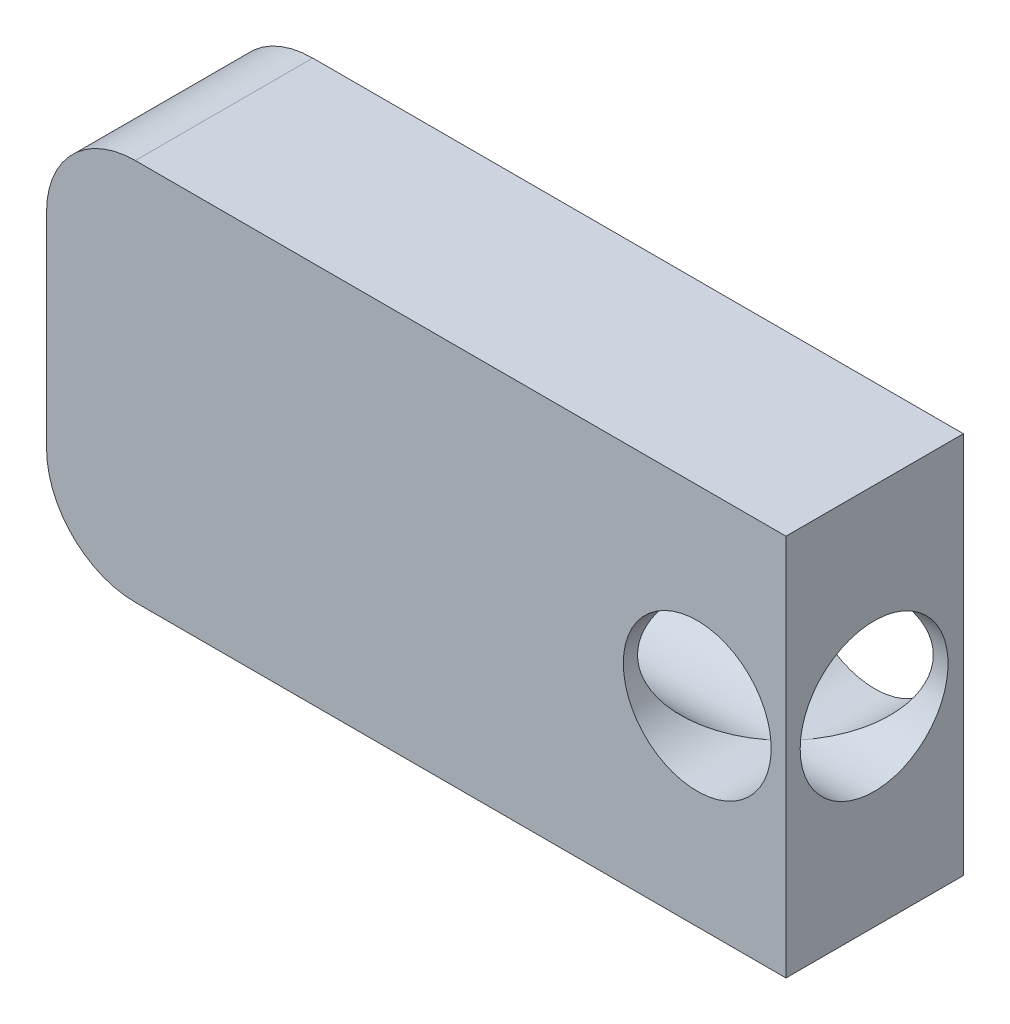
ISO-10303-21;
HEADER;
FILE_DESCRIPTION(('STEP AP214'),'2;1');
FILE_NAME('part.step','',(''),(''),'','','');
FILE_SCHEMA(('AUTOMOTIVE_DESIGN { 1 0 10303 214 1 1 1 1 }'));
ENDSEC;
DATA;
#1=APPLICATION_CONTEXT('core data for automotive mechanical design processes');
#2=APPLICATION_PROTOCOL_DEFINITION('international standard','automotive_design',2000,#1);
#3=PRODUCT_CONTEXT('',#1,'mechanical');
#4=PRODUCT('Part','Part','',(#3));
#5=PRODUCT_RELATED_PRODUCT_CATEGORY('part','',(#4));
#6=PRODUCT_DEFINITION_FORMATION('','',#4);
#7=PRODUCT_DEFINITION_CONTEXT('part definition',#1,'design');
#8=PRODUCT_DEFINITION('design','',#6,#7);
#9=PRODUCT_DEFINITION_SHAPE('','',#8);
#10=(LENGTH_UNIT() NAMED_UNIT(*) SI_UNIT(.MILLI.,.METRE.));
#11=(NAMED_UNIT(*) PLANE_ANGLE_UNIT() SI_UNIT($,.RADIAN.));
#12=(NAMED_UNIT(*) SI_UNIT($,.STERADIAN.) SOLID_ANGLE_UNIT());
#13=UNCERTAINTY_MEASURE_WITH_UNIT(LENGTH_MEASURE(1.E-05),#10,'distance_accuracy_value','');
#14=(GEOMETRIC_REPRESENTATION_CONTEXT(3) GLOBAL_UNCERTAINTY_ASSIGNED_CONTEXT((#13)) GLOBAL_UNIT_ASSIGNED_CONTEXT((#10,
#11,#12)) REPRESENTATION_CONTEXT('',''));
#15=CARTESIAN_POINT('',(0.,0.,0.));
#16=DIRECTION('',(0.,0.,1.));
#17=DIRECTION('',(1.,0.,0.));
#18=AXIS2_PLACEMENT_3D('',#15,#16,#17);
#19=CARTESIAN_POINT('',(9.5,0.,6.));
#20=DIRECTION('',(0.,0.,-1.));
#21=DIRECTION('',(-1.,0.,0.));
#22=AXIS2_PLACEMENT_3D('',#19,#20,#21);
#23=CYLINDRICAL_SURFACE('',#22,2.5);
#24=CARTESIAN_POINT('',(9.5,0.,3.01965173208943));
#25=DIRECTION('',(-0.707106781186547,0.,-0.707106781186547));
#26=DIRECTION('',(0.707106781186547,0.,-0.707106781186547));
#27=AXIS2_PLACEMENT_3D('',#24,#25,#26);
#28=ELLIPSE('',#27,3.53553390593274,2.5);
#29=CARTESIAN_POINT('',(9.5,2.5,3.01965173208943));
#30=VERTEX_POINT('',#29);
#31=CARTESIAN_POINT('',(9.5,-2.5,3.01965173208943));
#32=VERTEX_POINT('',#31);
#33=EDGE_CURVE('E11',#30,#32,#28,.F.);
#34=ORIENTED_EDGE('',*,*,#33,.F.);
#35=CARTESIAN_POINT('',(9.5,0.,3.01965173208943));
#36=DIRECTION('',(0.707106781186547,0.,-0.707106781186547));
#37=DIRECTION('',(-0.707106781186547,0.,-0.707106781186547));
#38=AXIS2_PLACEMENT_3D('',#35,#36,#37);
#39=ELLIPSE('',#38,3.53553390593274,2.5);
#40=EDGE_CURVE('E53',#32,#30,#39,.F.);
#41=ORIENTED_EDGE('',*,*,#40,.F.);
#42=EDGE_LOOP('',(#34,#41));
#43=FACE_BOUND('',#42,.T.);
#44=CARTESIAN_POINT('',(9.5,0.,6.));
#45=DIRECTION('',(0.,0.,1.));
#46=DIRECTION('',(-1.,0.,0.));
#47=AXIS2_PLACEMENT_3D('',#44,#45,#46);
#48=CIRCLE('',#47,2.5);
#49=CARTESIAN_POINT('',(7.,0.,6.));
#50=VERTEX_POINT('',#49);
#51=EDGE_CURVE('E139',#50,#50,#48,.T.);
#52=ORIENTED_EDGE('',*,*,#51,.T.);
#53=EDGE_LOOP('',(#52));
#54=FACE_BOUND('',#53,.T.);
#55=ADVANCED_FACE('F39',(#43,#54),#23,.F.);
#56=CARTESIAN_POINT('',(-9.5,-3.46843733601267,6.));
#57=DIRECTION('',(0.,0.,1.));
#58=DIRECTION('',(1.,0.,0.));
#59=AXIS2_PLACEMENT_3D('',#56,#57,#58);
#60=PLANE('',#59);
#61=DIRECTION('',(0.,1.,0.));
#62=VECTOR('',#61,1.);
#63=CARTESIAN_POINT('',(12.5,6.46843733601267,6.));
#64=LINE('',#63,#62);
#65=CARTESIAN_POINT('',(12.5,-6.46843733601267,6.));
#66=VERTEX_POINT('',#65);
#67=CARTESIAN_POINT('',(12.5,6.46843733601267,6.));
#68=VERTEX_POINT('',#67);
#69=EDGE_CURVE('E147',#66,#68,#64,.T.);
#70=ORIENTED_EDGE('',*,*,#69,.T.);
#71=DIRECTION('',(-1.,0.,0.));
#72=VECTOR('',#71,1.);
#73=CARTESIAN_POINT('',(-9.49999999999998,6.46843733601267,6.));
#74=LINE('',#73,#72);
#75=CARTESIAN_POINT('',(-9.49999999999998,6.46843733601267,6.));
#76=VERTEX_POINT('',#75);
#77=EDGE_CURVE('E98',#68,#76,#74,.T.);
#78=ORIENTED_EDGE('',*,*,#77,.T.);
#79=CARTESIAN_POINT('',(-9.5,3.46843733601267,6.));
#80=DIRECTION('',(0.,0.,1.));
#81=DIRECTION('',(1.,0.,0.));
#82=AXIS2_PLACEMENT_3D('',#79,#80,#81);
#83=CIRCLE('',#82,3.);
#84=CARTESIAN_POINT('',(-12.5,3.46843733601265,6.));
#85=VERTEX_POINT('',#84);
#86=EDGE_CURVE('E114',#76,#85,#83,.T.);
#87=ORIENTED_EDGE('',*,*,#86,.T.);
#88=DIRECTION('',(0.,-1.,0.));
#89=VECTOR('',#88,1.);
#90=CARTESIAN_POINT('',(-12.5,3.46843733601265,6.));
#91=LINE('',#90,#89);
#92=CARTESIAN_POINT('',(-12.5,-3.46843733601265,6.));
#93=VERTEX_POINT('',#92);
#94=EDGE_CURVE('E106',#85,#93,#91,.T.);
#95=ORIENTED_EDGE('',*,*,#94,.T.);
#96=CARTESIAN_POINT('',(-9.5,-3.46843733601267,6.));
#97=DIRECTION('',(0.,0.,1.));
#98=DIRECTION('',(1.,0.,0.));
#99=AXIS2_PLACEMENT_3D('',#96,#97,#98);
#100=CIRCLE('',#99,3.);
#101=CARTESIAN_POINT('',(-9.49999999999998,-6.46843733601267,6.));
#102=VERTEX_POINT('',#101);
#103=EDGE_CURVE('E111',#93,#102,#100,.T.);
#104=ORIENTED_EDGE('',*,*,#103,.T.);
#105=DIRECTION('',(1.,0.,0.));
#106=VECTOR('',#105,1.);
#107=CARTESIAN_POINT('',(-9.49999999999998,-6.46843733601267,6.));
#108=LINE('',#107,#106);
#109=EDGE_CURVE('E62',#102,#66,#108,.T.);
#110=ORIENTED_EDGE('',*,*,#109,.T.);
#111=EDGE_LOOP('',(#70,#78,#87,#95,#104,#110));
#112=FACE_BOUND('',#111,.T.);
#113=ORIENTED_EDGE('',*,*,#51,.F.);
#114=EDGE_LOOP('',(#113));
#115=FACE_BOUND('',#114,.T.);
#116=ADVANCED_FACE('F108',(#112,#115),#60,.T.);
#117=CARTESIAN_POINT('',(-9.5,-3.46843733601267,0.));
#118=DIRECTION('',(0.,0.,1.));
#119=DIRECTION('',(1.,0.,0.));
#120=AXIS2_PLACEMENT_3D('',#117,#118,#119);
#121=PLANE('',#120);
#122=DIRECTION('',(0.,1.,0.));
#123=VECTOR('',#122,1.);
#124=CARTESIAN_POINT('',(12.5,6.46843733601267,0.));
#125=LINE('',#124,#123);
#126=CARTESIAN_POINT('',(12.5,-6.46843733601267,0.));
#127=VERTEX_POINT('',#126);
#128=CARTESIAN_POINT('',(12.5,6.46843733601267,0.));
#129=VERTEX_POINT('',#128);
#130=EDGE_CURVE('E135',#127,#129,#125,.T.);
#131=ORIENTED_EDGE('',*,*,#130,.F.);
#132=DIRECTION('',(1.,0.,0.));
#133=VECTOR('',#132,1.);
#134=CARTESIAN_POINT('',(-9.49999999999998,-6.46843733601267,0.));
#135=LINE('',#134,#133);
#136=CARTESIAN_POINT('',(-9.49999999999998,-6.46843733601267,0.));
#137=VERTEX_POINT('',#136);
#138=EDGE_CURVE('E89',#137,#127,#135,.T.);
#139=ORIENTED_EDGE('',*,*,#138,.F.);
#140=CARTESIAN_POINT('',(-9.5,-3.46843733601267,0.));
#141=DIRECTION('',(0.,0.,1.));
#142=DIRECTION('',(1.,0.,0.));
#143=AXIS2_PLACEMENT_3D('',#140,#141,#142);
#144=CIRCLE('',#143,3.);
#145=CARTESIAN_POINT('',(-12.5,-3.46843733601265,0.));
#146=VERTEX_POINT('',#145);
#147=EDGE_CURVE('E144',#146,#137,#144,.T.);
#148=ORIENTED_EDGE('',*,*,#147,.F.);
#149=DIRECTION('',(0.,-1.,0.));
#150=VECTOR('',#149,1.);
#151=CARTESIAN_POINT('',(-12.5,3.46843733601265,0.));
#152=LINE('',#151,#150);
#153=CARTESIAN_POINT('',(-12.5,3.46843733601265,0.));
#154=VERTEX_POINT('',#153);
#155=EDGE_CURVE('E123',#154,#146,#152,.T.);
#156=ORIENTED_EDGE('',*,*,#155,.F.);
#157=CARTESIAN_POINT('',(-9.5,3.46843733601267,0.));
#158=DIRECTION('',(0.,0.,1.));
#159=DIRECTION('',(1.,0.,0.));
#160=AXIS2_PLACEMENT_3D('',#157,#158,#159);
#161=CIRCLE('',#160,3.);
#162=CARTESIAN_POINT('',(-9.49999999999998,6.46843733601267,0.));
#163=VERTEX_POINT('',#162);
#164=EDGE_CURVE('E141',#163,#154,#161,.T.);
#165=ORIENTED_EDGE('',*,*,#164,.F.);
#166=DIRECTION('',(-1.,0.,0.));
#167=VECTOR('',#166,1.);
#168=CARTESIAN_POINT('',(-9.49999999999998,6.46843733601267,0.));
#169=LINE('',#168,#167);
#170=EDGE_CURVE('E138',#129,#163,#169,.T.);
#171=ORIENTED_EDGE('',*,*,#170,.F.);
#172=EDGE_LOOP('',(#131,#139,#148,#156,#165,#171));
#173=FACE_BOUND('',#172,.T.);
#174=CARTESIAN_POINT('',(9.5,0.,0.));
#175=DIRECTION('',(0.,0.,1.));
#176=DIRECTION('',(-1.,0.,0.));
#177=AXIS2_PLACEMENT_3D('',#174,#175,#176);
#178=CIRCLE('',#177,2.5);
#179=CARTESIAN_POINT('',(7.,0.,0.));
#180=VERTEX_POINT('',#179);
#181=EDGE_CURVE('E175',#180,#180,#178,.T.);
#182=ORIENTED_EDGE('',*,*,#181,.T.);
#183=EDGE_LOOP('',(#182));
#184=FACE_BOUND('',#183,.T.);
#185=ADVANCED_FACE('F195',(#173,#184),#121,.F.);
#186=CARTESIAN_POINT('',(12.5,6.46843733601267,6.));
#187=DIRECTION('',(-1.,0.,0.));
#188=DIRECTION('',(0.,0.,1.));
#189=AXIS2_PLACEMENT_3D('',#186,#187,#188);
#190=PLANE('',#189);
#191=CARTESIAN_POINT('',(12.5,0.,3.01965173208943));
#192=DIRECTION('',(-1.,0.,0.));
#193=DIRECTION('',(0.,0.,1.));
#194=AXIS2_PLACEMENT_3D('',#191,#192,#193);
#195=CIRCLE('',#194,2.5);
#196=CARTESIAN_POINT('',(12.5,0.,5.51965173208943));
#197=VERTEX_POINT('',#196);
#198=EDGE_CURVE('E177',#197,#197,#195,.T.);
#199=ORIENTED_EDGE('',*,*,#198,.T.);
#200=EDGE_LOOP('',(#199));
#201=FACE_BOUND('',#200,.T.);
#202=ORIENTED_EDGE('',*,*,#130,.T.);
#203=DIRECTION('',(0.,0.,-1.));
#204=VECTOR('',#203,1.);
#205=CARTESIAN_POINT('',(12.5,6.46843733601267,6.));
#206=LINE('',#205,#204);
#207=EDGE_CURVE('E154',#68,#129,#206,.T.);
#208=ORIENTED_EDGE('',*,*,#207,.F.);
#209=ORIENTED_EDGE('',*,*,#69,.F.);
#210=DIRECTION('',(0.,0.,-1.));
#211=VECTOR('',#210,1.);
#212=CARTESIAN_POINT('',(12.5,-6.46843733601267,6.));
#213=LINE('',#212,#211);
#214=EDGE_CURVE('E131',#66,#127,#213,.T.);
#215=ORIENTED_EDGE('',*,*,#214,.T.);
#216=EDGE_LOOP('',(#202,#208,#209,#215));
#217=FACE_BOUND('',#216,.T.);
#218=ADVANCED_FACE('F41',(#201,#217),#190,.F.);
#219=CARTESIAN_POINT('',(-9.49999999999998,6.46843733601267,6.));
#220=DIRECTION('',(0.,-1.,0.));
#221=DIRECTION('',(0.,0.,-1.));
#222=AXIS2_PLACEMENT_3D('',#219,#220,#221);
#223=PLANE('',#222);
#224=ORIENTED_EDGE('',*,*,#170,.T.);
#225=DIRECTION('',(0.,0.,-1.));
#226=VECTOR('',#225,1.);
#227=CARTESIAN_POINT('',(-9.49999999999998,6.46843733601267,6.));
#228=LINE('',#227,#226);
#229=EDGE_CURVE('E151',#76,#163,#228,.T.);
#230=ORIENTED_EDGE('',*,*,#229,.F.);
#231=ORIENTED_EDGE('',*,*,#77,.F.);
#232=ORIENTED_EDGE('',*,*,#207,.T.);
#233=EDGE_LOOP('',(#224,#230,#231,#232));
#234=FACE_BOUND('',#233,.T.);
#235=ADVANCED_FACE('F189',(#234),#223,.F.);
#236=CARTESIAN_POINT('',(-9.5,3.46843733601267,6.));
#237=DIRECTION('',(0.,0.,-1.));
#238=DIRECTION('',(-1.,0.,0.));
#239=AXIS2_PLACEMENT_3D('',#236,#237,#238);
#240=CYLINDRICAL_SURFACE('',#239,3.);
#241=ORIENTED_EDGE('',*,*,#164,.T.);
#242=DIRECTION('',(0.,0.,-1.));
#243=VECTOR('',#242,1.);
#244=CARTESIAN_POINT('',(-12.5,3.46843733601265,6.));
#245=LINE('',#244,#243);
#246=EDGE_CURVE('E126',#85,#154,#245,.T.);
#247=ORIENTED_EDGE('',*,*,#246,.F.);
#248=ORIENTED_EDGE('',*,*,#86,.F.);
#249=ORIENTED_EDGE('',*,*,#229,.T.);
#250=EDGE_LOOP('',(#241,#247,#248,#249));
#251=FACE_BOUND('',#250,.T.);
#252=ADVANCED_FACE('F192',(#251),#240,.T.);
#253=CARTESIAN_POINT('',(-12.5,3.46843733601265,6.));
#254=DIRECTION('',(1.,0.,0.));
#255=DIRECTION('',(0.,0.,-1.));
#256=AXIS2_PLACEMENT_3D('',#253,#254,#255);
#257=PLANE('',#256);
#258=CARTESIAN_POINT('',(-12.5,0.,3.01965173208943));
#259=DIRECTION('',(-1.,0.,0.));
#260=DIRECTION('',(0.,0.,1.));
#261=AXIS2_PLACEMENT_3D('',#258,#259,#260);
#262=CIRCLE('',#261,2.5);
#263=CARTESIAN_POINT('',(-12.5,0.,5.51965173208943));
#264=VERTEX_POINT('',#263);
#265=EDGE_CURVE('E182',#264,#264,#262,.T.);
#266=ORIENTED_EDGE('',*,*,#265,.F.);
#267=EDGE_LOOP('',(#266));
#268=FACE_BOUND('',#267,.T.);
#269=ORIENTED_EDGE('',*,*,#155,.T.);
#270=DIRECTION('',(0.,0.,-1.));
#271=VECTOR('',#270,1.);
#272=CARTESIAN_POINT('',(-12.5,-3.46843733601265,6.));
#273=LINE('',#272,#271);
#274=EDGE_CURVE('E120',#93,#146,#273,.T.);
#275=ORIENTED_EDGE('',*,*,#274,.F.);
#276=ORIENTED_EDGE('',*,*,#94,.F.);
#277=ORIENTED_EDGE('',*,*,#246,.T.);
#278=EDGE_LOOP('',(#269,#275,#276,#277));
#279=FACE_BOUND('',#278,.T.);
#280=ADVANCED_FACE('F121',(#268,#279),#257,.F.);
#281=CARTESIAN_POINT('',(-9.5,-3.46843733601267,6.));
#282=DIRECTION('',(0.,0.,-1.));
#283=DIRECTION('',(-1.,0.,0.));
#284=AXIS2_PLACEMENT_3D('',#281,#282,#283);
#285=CYLINDRICAL_SURFACE('',#284,3.);
#286=ORIENTED_EDGE('',*,*,#147,.T.);
#287=DIRECTION('',(0.,0.,-1.));
#288=VECTOR('',#287,1.);
#289=CARTESIAN_POINT('',(-9.49999999999998,-6.46843733601267,6.));
#290=LINE('',#289,#288);
#291=EDGE_CURVE('E127',#102,#137,#290,.T.);
#292=ORIENTED_EDGE('',*,*,#291,.F.);
#293=ORIENTED_EDGE('',*,*,#103,.F.);
#294=ORIENTED_EDGE('',*,*,#274,.T.);
#295=EDGE_LOOP('',(#286,#292,#293,#294));
#296=FACE_BOUND('',#295,.T.);
#297=ADVANCED_FACE('F129',(#296),#285,.T.);
#298=CARTESIAN_POINT('',(-9.49999999999998,-6.46843733601267,6.));
#299=DIRECTION('',(0.,1.,0.));
#300=DIRECTION('',(0.,0.,1.));
#301=AXIS2_PLACEMENT_3D('',#298,#299,#300);
#302=PLANE('',#301);
#303=ORIENTED_EDGE('',*,*,#138,.T.);
#304=ORIENTED_EDGE('',*,*,#214,.F.);
#305=ORIENTED_EDGE('',*,*,#109,.F.);
#306=ORIENTED_EDGE('',*,*,#291,.T.);
#307=EDGE_LOOP('',(#303,#304,#305,#306));
#308=FACE_BOUND('',#307,.T.);
#309=ADVANCED_FACE('F171',(#308),#302,.F.);
#310=CARTESIAN_POINT('',(9.5,0.,3.01965173208943));
#311=DIRECTION('',(-0.707106781186547,0.,-0.707106781186547));
#312=DIRECTION('',(0.707106781186547,0.,-0.707106781186547));
#313=AXIS2_PLACEMENT_3D('',#310,#311,#312);
#314=ELLIPSE('',#313,3.53553390593274,2.5);
#315=EDGE_CURVE('E47',#30,#32,#314,.T.);
#316=ORIENTED_EDGE('',*,*,#315,.F.);
#317=CARTESIAN_POINT('',(9.5,0.,3.01965173208943));
#318=DIRECTION('',(0.707106781186547,0.,-0.707106781186547));
#319=DIRECTION('',(-0.707106781186547,0.,-0.707106781186547));
#320=AXIS2_PLACEMENT_3D('',#317,#318,#319);
#321=ELLIPSE('',#320,3.53553390593274,2.5);
#322=EDGE_CURVE('E157',#32,#30,#321,.T.);
#323=ORIENTED_EDGE('',*,*,#322,.F.);
#324=EDGE_LOOP('',(#316,#323));
#325=FACE_BOUND('',#324,.T.);
#326=ORIENTED_EDGE('',*,*,#181,.F.);
#327=EDGE_LOOP('',(#326));
#328=FACE_BOUND('',#327,.T.);
#329=ADVANCED_FACE('F168',(#325,#328),#23,.F.);
#330=CARTESIAN_POINT('',(12.5,0.,3.01965173208943));
#331=DIRECTION('',(-1.,0.,0.));
#332=DIRECTION('',(0.,0.,1.));
#333=AXIS2_PLACEMENT_3D('',#330,#331,#332);
#334=CYLINDRICAL_SURFACE('',#333,2.5);
#335=ORIENTED_EDGE('',*,*,#315,.T.);
#336=ORIENTED_EDGE('',*,*,#40,.T.);
#337=EDGE_LOOP('',(#335,#336));
#338=FACE_BOUND('',#337,.T.);
#339=ORIENTED_EDGE('',*,*,#198,.F.);
#340=EDGE_LOOP('',(#339));
#341=FACE_BOUND('',#340,.T.);
#342=ADVANCED_FACE('F161',(#338,#341),#334,.F.);
#343=ORIENTED_EDGE('',*,*,#33,.T.);
#344=ORIENTED_EDGE('',*,*,#322,.T.);
#345=EDGE_LOOP('',(#343,#344));
#346=FACE_BOUND('',#345,.T.);
#347=ORIENTED_EDGE('',*,*,#265,.T.);
#348=EDGE_LOOP('',(#347));
#349=FACE_BOUND('',#348,.T.);
#350=ADVANCED_FACE('F166',(#346,#349),#334,.F.);
#351=CLOSED_SHELL('',(#55,#116,#185,#218,#235,#252,#280,#297,#309,#329,#342,#350));
#352=MANIFOLD_SOLID_BREP('B2',#351);
#353=ADVANCED_BREP_SHAPE_REPRESENTATION('',(#18,#352),#14);
#354=SHAPE_DEFINITION_REPRESENTATION(#9,#353);
ENDSEC;
END-ISO-10303-21;
